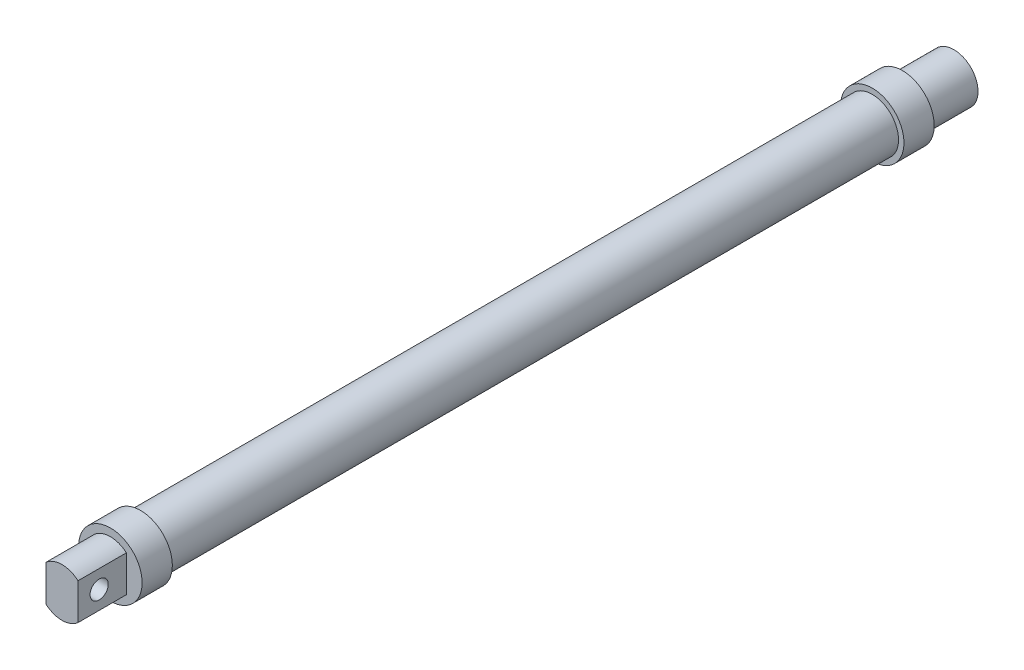
ISO-10303-21;
HEADER;
FILE_DESCRIPTION(('STEP AP214'),'2;1');
FILE_NAME('part.step','',(''),(''),'','','');
FILE_SCHEMA(('AUTOMOTIVE_DESIGN { 1 0 10303 214 1 1 1 1 }'));
ENDSEC;
DATA;
#1=APPLICATION_CONTEXT('core data for automotive mechanical design processes');
#2=APPLICATION_PROTOCOL_DEFINITION('international standard','automotive_design',2000,#1);
#3=PRODUCT_CONTEXT('',#1,'mechanical');
#4=PRODUCT('Part','Part','',(#3));
#5=PRODUCT_RELATED_PRODUCT_CATEGORY('part','',(#4));
#6=PRODUCT_DEFINITION_FORMATION('','',#4);
#7=PRODUCT_DEFINITION_CONTEXT('part definition',#1,'design');
#8=PRODUCT_DEFINITION('design','',#6,#7);
#9=PRODUCT_DEFINITION_SHAPE('','',#8);
#10=(LENGTH_UNIT() NAMED_UNIT(*) SI_UNIT(.MILLI.,.METRE.));
#11=(NAMED_UNIT(*) PLANE_ANGLE_UNIT() SI_UNIT($,.RADIAN.));
#12=(NAMED_UNIT(*) SI_UNIT($,.STERADIAN.) SOLID_ANGLE_UNIT());
#13=UNCERTAINTY_MEASURE_WITH_UNIT(LENGTH_MEASURE(1.E-05),#10,'distance_accuracy_value','');
#14=(GEOMETRIC_REPRESENTATION_CONTEXT(3) GLOBAL_UNCERTAINTY_ASSIGNED_CONTEXT((#13)) GLOBAL_UNIT_ASSIGNED_CONTEXT((#10,
#11,#12)) REPRESENTATION_CONTEXT('',''));
#15=CARTESIAN_POINT('',(0.,0.,0.));
#16=DIRECTION('',(0.,0.,1.));
#17=DIRECTION('',(1.,0.,0.));
#18=AXIS2_PLACEMENT_3D('',#15,#16,#17);
#19=CARTESIAN_POINT('',(0.,0.,-252.));
#20=DIRECTION('',(0.,0.,-1.));
#21=DIRECTION('',(-1.,0.,0.));
#22=AXIS2_PLACEMENT_3D('',#19,#20,#21);
#23=PLANE('',#22);
#24=CARTESIAN_POINT('',(0.,0.,-252.));
#25=DIRECTION('',(0.,0.,-1.));
#26=DIRECTION('',(-1.,0.,0.));
#27=AXIS2_PLACEMENT_3D('',#24,#25,#26);
#28=CIRCLE('',#27,10.5);
#29=CARTESIAN_POINT('',(-10.5,0.,-252.));
#30=VERTEX_POINT('',#29);
#31=EDGE_CURVE('E162',#30,#30,#28,.T.);
#32=ORIENTED_EDGE('',*,*,#31,.T.);
#33=EDGE_LOOP('',(#32));
#34=FACE_BOUND('',#33,.T.);
#35=CARTESIAN_POINT('',(0.,0.,-252.));
#36=DIRECTION('',(0.,0.,-1.));
#37=DIRECTION('',(-1.,0.,0.));
#38=AXIS2_PLACEMENT_3D('',#35,#36,#37);
#39=CIRCLE('',#38,8.);
#40=CARTESIAN_POINT('',(-8.,0.,-252.));
#41=VERTEX_POINT('',#40);
#42=EDGE_CURVE('E171',#41,#41,#39,.T.);
#43=ORIENTED_EDGE('',*,*,#42,.F.);
#44=EDGE_LOOP('',(#43));
#45=FACE_BOUND('',#44,.T.);
#46=ADVANCED_FACE('F36',(#34,#45),#23,.T.);
#47=CARTESIAN_POINT('',(0.,0.,0.));
#48=DIRECTION('',(0.,0.,1.));
#49=DIRECTION('',(1.,0.,0.));
#50=AXIS2_PLACEMENT_3D('',#47,#48,#49);
#51=PLANE('',#50);
#52=CARTESIAN_POINT('',(0.,0.,0.));
#53=DIRECTION('',(0.,0.,1.));
#54=DIRECTION('',(1.,0.,0.));
#55=AXIS2_PLACEMENT_3D('',#52,#53,#54);
#56=CIRCLE('',#55,10.5);
#57=CARTESIAN_POINT('',(10.5,0.,0.));
#58=VERTEX_POINT('',#57);
#59=EDGE_CURVE('E115',#58,#58,#56,.T.);
#60=ORIENTED_EDGE('',*,*,#59,.F.);
#61=EDGE_LOOP('',(#60));
#62=FACE_BOUND('',#61,.T.);
#63=CARTESIAN_POINT('',(0.,0.,0.));
#64=DIRECTION('',(0.,0.,1.));
#65=DIRECTION('',(1.,0.,0.));
#66=AXIS2_PLACEMENT_3D('',#63,#64,#65);
#67=CIRCLE('',#66,8.7);
#68=CARTESIAN_POINT('',(8.7,0.,0.));
#69=VERTEX_POINT('',#68);
#70=EDGE_CURVE('E11',#69,#69,#67,.F.);
#71=ORIENTED_EDGE('',*,*,#70,.F.);
#72=EDGE_LOOP('',(#71));
#73=FACE_BOUND('',#72,.T.);
#74=ADVANCED_FACE('F121',(#62,#73),#51,.F.);
#75=CARTESIAN_POINT('',(0.,0.,10.));
#76=DIRECTION('',(0.,0.,-1.));
#77=DIRECTION('',(-1.,0.,0.));
#78=AXIS2_PLACEMENT_3D('',#75,#76,#77);
#79=CYLINDRICAL_SURFACE('',#78,10.5);
#80=CARTESIAN_POINT('',(0.,0.,10.));
#81=DIRECTION('',(0.,0.,1.));
#82=DIRECTION('',(1.,0.,0.));
#83=AXIS2_PLACEMENT_3D('',#80,#81,#82);
#84=CIRCLE('',#83,10.5);
#85=CARTESIAN_POINT('',(10.5,0.,10.));
#86=VERTEX_POINT('',#85);
#87=EDGE_CURVE('E44',#86,#86,#84,.T.);
#88=ORIENTED_EDGE('',*,*,#87,.F.);
#89=EDGE_LOOP('',(#88));
#90=FACE_BOUND('',#89,.T.);
#91=ORIENTED_EDGE('',*,*,#59,.T.);
#92=EDGE_LOOP('',(#91));
#93=FACE_BOUND('',#92,.T.);
#94=ADVANCED_FACE('F38',(#90,#93),#79,.T.);
#95=CARTESIAN_POINT('',(0.,0.,10.));
#96=DIRECTION('',(0.,0.,1.));
#97=DIRECTION('',(1.,0.,0.));
#98=AXIS2_PLACEMENT_3D('',#95,#96,#97);
#99=PLANE('',#98);
#100=DIRECTION('',(0.,1.,0.));
#101=VECTOR('',#100,1.);
#102=CARTESIAN_POINT('',(-5.29150262212918,-23.2414213562373,10.));
#103=LINE('',#102,#101);
#104=CARTESIAN_POINT('',(-5.29150262212918,-6.,10.));
#105=VERTEX_POINT('',#104);
#106=CARTESIAN_POINT('',(-5.29150262212918,6.,10.));
#107=VERTEX_POINT('',#106);
#108=EDGE_CURVE('E103',#105,#107,#103,.T.);
#109=ORIENTED_EDGE('',*,*,#108,.T.);
#110=CARTESIAN_POINT('',(0.,0.,10.));
#111=DIRECTION('',(0.,0.,1.));
#112=DIRECTION('',(1.,0.,0.));
#113=AXIS2_PLACEMENT_3D('',#110,#111,#112);
#114=CIRCLE('',#113,8.);
#115=CARTESIAN_POINT('',(5.29150262212918,6.,10.));
#116=VERTEX_POINT('',#115);
#117=EDGE_CURVE('E110',#116,#107,#114,.T.);
#118=ORIENTED_EDGE('',*,*,#117,.F.);
#119=DIRECTION('',(0.,1.,0.));
#120=VECTOR('',#119,1.);
#121=CARTESIAN_POINT('',(5.29150262212918,-23.2414213562373,10.));
#122=LINE('',#121,#120);
#123=CARTESIAN_POINT('',(5.29150262212918,-6.,10.));
#124=VERTEX_POINT('',#123);
#125=EDGE_CURVE('E108',#124,#116,#122,.T.);
#126=ORIENTED_EDGE('',*,*,#125,.F.);
#127=CARTESIAN_POINT('',(0.,0.,10.));
#128=DIRECTION('',(0.,0.,1.));
#129=DIRECTION('',(1.,0.,0.));
#130=AXIS2_PLACEMENT_3D('',#127,#128,#129);
#131=CIRCLE('',#130,8.);
#132=EDGE_CURVE('E94',#105,#124,#131,.T.);
#133=ORIENTED_EDGE('',*,*,#132,.F.);
#134=EDGE_LOOP('',(#109,#118,#126,#133));
#135=FACE_BOUND('',#134,.T.);
#136=ORIENTED_EDGE('',*,*,#87,.T.);
#137=EDGE_LOOP('',(#136));
#138=FACE_BOUND('',#137,.T.);
#139=ADVANCED_FACE('F183',(#135,#138),#99,.T.);
#140=CARTESIAN_POINT('',(-5.29150262212918,-23.2414213562373,26.));
#141=DIRECTION('',(-1.,0.,0.));
#142=DIRECTION('',(0.,0.,1.));
#143=AXIS2_PLACEMENT_3D('',#140,#141,#142);
#144=PLANE('',#143);
#145=CARTESIAN_POINT('',(-5.29150262212918,0.,19.));
#146=DIRECTION('',(-1.,0.,0.));
#147=DIRECTION('',(0.,0.,1.));
#148=AXIS2_PLACEMENT_3D('',#145,#146,#147);
#149=CIRCLE('',#148,3.);
#150=CARTESIAN_POINT('',(-5.29150262212918,0.,22.));
#151=VERTEX_POINT('',#150);
#152=EDGE_CURVE('E177',#151,#151,#149,.F.);
#153=ORIENTED_EDGE('',*,*,#152,.T.);
#154=EDGE_LOOP('',(#153));
#155=FACE_BOUND('',#154,.T.);
#156=ORIENTED_EDGE('',*,*,#108,.F.);
#157=DIRECTION('',(0.,0.,-1.));
#158=VECTOR('',#157,1.);
#159=CARTESIAN_POINT('',(-5.29150262212918,-6.,26.));
#160=LINE('',#159,#158);
#161=CARTESIAN_POINT('',(-5.29150262212918,-6.,26.));
#162=VERTEX_POINT('',#161);
#163=EDGE_CURVE('E79',#162,#105,#160,.T.);
#164=ORIENTED_EDGE('',*,*,#163,.F.);
#165=DIRECTION('',(0.,1.,0.));
#166=VECTOR('',#165,1.);
#167=CARTESIAN_POINT('',(-5.29150262212918,-23.2414213562373,26.));
#168=LINE('',#167,#166);
#169=CARTESIAN_POINT('',(-5.29150262212918,6.,26.));
#170=VERTEX_POINT('',#169);
#171=EDGE_CURVE('E87',#162,#170,#168,.T.);
#172=ORIENTED_EDGE('',*,*,#171,.T.);
#173=DIRECTION('',(0.,0.,-1.));
#174=VECTOR('',#173,1.);
#175=CARTESIAN_POINT('',(-5.29150262212918,6.,26.));
#176=LINE('',#175,#174);
#177=EDGE_CURVE('E76',#170,#107,#176,.T.);
#178=ORIENTED_EDGE('',*,*,#177,.T.);
#179=EDGE_LOOP('',(#156,#164,#172,#178));
#180=FACE_BOUND('',#179,.T.);
#181=ADVANCED_FACE('F181',(#155,#180),#144,.T.);
#182=CARTESIAN_POINT('',(0.,0.,26.));
#183=DIRECTION('',(0.,0.,-1.));
#184=DIRECTION('',(-1.,0.,0.));
#185=AXIS2_PLACEMENT_3D('',#182,#183,#184);
#186=CYLINDRICAL_SURFACE('',#185,8.);
#187=ORIENTED_EDGE('',*,*,#132,.T.);
#188=DIRECTION('',(0.,0.,-1.));
#189=VECTOR('',#188,1.);
#190=CARTESIAN_POINT('',(5.29150262212918,-6.,26.));
#191=LINE('',#190,#189);
#192=CARTESIAN_POINT('',(5.29150262212918,-6.,26.));
#193=VERTEX_POINT('',#192);
#194=EDGE_CURVE('E91',#193,#124,#191,.T.);
#195=ORIENTED_EDGE('',*,*,#194,.F.);
#196=CARTESIAN_POINT('',(0.,0.,26.));
#197=DIRECTION('',(0.,0.,1.));
#198=DIRECTION('',(1.,0.,0.));
#199=AXIS2_PLACEMENT_3D('',#196,#197,#198);
#200=CIRCLE('',#199,8.);
#201=EDGE_CURVE('E82',#162,#193,#200,.T.);
#202=ORIENTED_EDGE('',*,*,#201,.F.);
#203=ORIENTED_EDGE('',*,*,#163,.T.);
#204=EDGE_LOOP('',(#187,#195,#202,#203));
#205=FACE_BOUND('',#204,.T.);
#206=ADVANCED_FACE('F92',(#205),#186,.T.);
#207=CARTESIAN_POINT('',(5.29150262212918,-23.2414213562373,26.));
#208=DIRECTION('',(-1.,0.,0.));
#209=DIRECTION('',(0.,0.,1.));
#210=AXIS2_PLACEMENT_3D('',#207,#208,#209);
#211=PLANE('',#210);
#212=CARTESIAN_POINT('',(5.29150262212918,0.,19.));
#213=DIRECTION('',(1.,0.,0.));
#214=DIRECTION('',(0.,0.,-1.));
#215=AXIS2_PLACEMENT_3D('',#212,#213,#214);
#216=CIRCLE('',#215,3.);
#217=CARTESIAN_POINT('',(5.29150262212918,0.,16.));
#218=VERTEX_POINT('',#217);
#219=EDGE_CURVE('E106',#218,#218,#216,.T.);
#220=ORIENTED_EDGE('',*,*,#219,.F.);
#221=EDGE_LOOP('',(#220));
#222=FACE_BOUND('',#221,.T.);
#223=ORIENTED_EDGE('',*,*,#125,.T.);
#224=DIRECTION('',(0.,0.,-1.));
#225=VECTOR('',#224,1.);
#226=CARTESIAN_POINT('',(5.29150262212918,6.,26.));
#227=LINE('',#226,#225);
#228=CARTESIAN_POINT('',(5.29150262212918,6.,26.));
#229=VERTEX_POINT('',#228);
#230=EDGE_CURVE('E51',#229,#116,#227,.T.);
#231=ORIENTED_EDGE('',*,*,#230,.F.);
#232=DIRECTION('',(0.,1.,0.));
#233=VECTOR('',#232,1.);
#234=CARTESIAN_POINT('',(5.29150262212918,-23.2414213562373,26.));
#235=LINE('',#234,#233);
#236=EDGE_CURVE('E86',#193,#229,#235,.T.);
#237=ORIENTED_EDGE('',*,*,#236,.F.);
#238=ORIENTED_EDGE('',*,*,#194,.T.);
#239=EDGE_LOOP('',(#223,#231,#237,#238));
#240=FACE_BOUND('',#239,.T.);
#241=ADVANCED_FACE('F98',(#222,#240),#211,.F.);
#242=CARTESIAN_POINT('',(0.,0.,26.));
#243=DIRECTION('',(0.,0.,-1.));
#244=DIRECTION('',(-1.,0.,0.));
#245=AXIS2_PLACEMENT_3D('',#242,#243,#244);
#246=CYLINDRICAL_SURFACE('',#245,8.);
#247=ORIENTED_EDGE('',*,*,#117,.T.);
#248=ORIENTED_EDGE('',*,*,#177,.F.);
#249=CARTESIAN_POINT('',(0.,0.,26.));
#250=DIRECTION('',(0.,0.,1.));
#251=DIRECTION('',(1.,0.,0.));
#252=AXIS2_PLACEMENT_3D('',#249,#250,#251);
#253=CIRCLE('',#252,8.);
#254=EDGE_CURVE('E59',#229,#170,#253,.T.);
#255=ORIENTED_EDGE('',*,*,#254,.F.);
#256=ORIENTED_EDGE('',*,*,#230,.T.);
#257=EDGE_LOOP('',(#247,#248,#255,#256));
#258=FACE_BOUND('',#257,.T.);
#259=ADVANCED_FACE('F196',(#258),#246,.T.);
#260=CARTESIAN_POINT('',(0.,-23.2414213562373,26.));
#261=DIRECTION('',(0.,0.,1.));
#262=DIRECTION('',(1.,0.,0.));
#263=AXIS2_PLACEMENT_3D('',#260,#261,#262);
#264=PLANE('',#263);
#265=ORIENTED_EDGE('',*,*,#171,.F.);
#266=ORIENTED_EDGE('',*,*,#201,.T.);
#267=ORIENTED_EDGE('',*,*,#236,.T.);
#268=ORIENTED_EDGE('',*,*,#254,.T.);
#269=EDGE_LOOP('',(#265,#266,#267,#268));
#270=FACE_BOUND('',#269,.T.);
#271=ADVANCED_FACE('F84',(#270),#264,.T.);
#272=CARTESIAN_POINT('',(-10.501,0.,19.));
#273=DIRECTION('',(1.,0.,0.));
#274=DIRECTION('',(0.,0.,-1.));
#275=AXIS2_PLACEMENT_3D('',#272,#273,#274);
#276=CYLINDRICAL_SURFACE('',#275,3.);
#277=ORIENTED_EDGE('',*,*,#152,.F.);
#278=EDGE_LOOP('',(#277));
#279=FACE_BOUND('',#278,.T.);
#280=ORIENTED_EDGE('',*,*,#219,.T.);
#281=EDGE_LOOP('',(#280));
#282=FACE_BOUND('',#281,.T.);
#283=ADVANCED_FACE('F129',(#279,#282),#276,.F.);
#284=CARTESIAN_POINT('',(0.,0.,-242.));
#285=DIRECTION('',(0.,0.,1.));
#286=DIRECTION('',(1.,0.,0.));
#287=AXIS2_PLACEMENT_3D('',#284,#285,#286);
#288=CYLINDRICAL_SURFACE('',#287,8.7);
#289=CARTESIAN_POINT('',(0.,0.,-242.));
#290=DIRECTION('',(0.,0.,-1.));
#291=DIRECTION('',(-1.,0.,0.));
#292=AXIS2_PLACEMENT_3D('',#289,#290,#291);
#293=CIRCLE('',#292,8.7);
#294=CARTESIAN_POINT('',(-8.7,0.,-242.));
#295=VERTEX_POINT('',#294);
#296=EDGE_CURVE('E168',#295,#295,#293,.T.);
#297=ORIENTED_EDGE('',*,*,#296,.F.);
#298=EDGE_LOOP('',(#297));
#299=FACE_BOUND('',#298,.T.);
#300=ORIENTED_EDGE('',*,*,#70,.T.);
#301=EDGE_LOOP('',(#300));
#302=FACE_BOUND('',#301,.T.);
#303=ADVANCED_FACE('F126',(#299,#302),#288,.T.);
#304=CARTESIAN_POINT('',(0.,0.,-242.));
#305=DIRECTION('',(0.,0.,-1.));
#306=DIRECTION('',(-1.,0.,0.));
#307=AXIS2_PLACEMENT_3D('',#304,#305,#306);
#308=PLANE('',#307);
#309=CARTESIAN_POINT('',(0.,0.,-242.));
#310=DIRECTION('',(0.,0.,-1.));
#311=DIRECTION('',(-1.,0.,0.));
#312=AXIS2_PLACEMENT_3D('',#309,#310,#311);
#313=CIRCLE('',#312,10.5);
#314=CARTESIAN_POINT('',(-10.5,0.,-242.));
#315=VERTEX_POINT('',#314);
#316=EDGE_CURVE('E165',#315,#315,#313,.T.);
#317=ORIENTED_EDGE('',*,*,#316,.F.);
#318=EDGE_LOOP('',(#317));
#319=FACE_BOUND('',#318,.T.);
#320=ORIENTED_EDGE('',*,*,#296,.T.);
#321=EDGE_LOOP('',(#320));
#322=FACE_BOUND('',#321,.T.);
#323=ADVANCED_FACE('F128',(#319,#322),#308,.F.);
#324=CARTESIAN_POINT('',(0.,0.,-252.));
#325=DIRECTION('',(0.,0.,1.));
#326=DIRECTION('',(1.,0.,0.));
#327=AXIS2_PLACEMENT_3D('',#324,#325,#326);
#328=CYLINDRICAL_SURFACE('',#327,10.5);
#329=ORIENTED_EDGE('',*,*,#31,.F.);
#330=EDGE_LOOP('',(#329));
#331=FACE_BOUND('',#330,.T.);
#332=ORIENTED_EDGE('',*,*,#316,.T.);
#333=EDGE_LOOP('',(#332));
#334=FACE_BOUND('',#333,.T.);
#335=ADVANCED_FACE('F136',(#331,#334),#328,.T.);
#336=CARTESIAN_POINT('',(0.,0.,-269.));
#337=DIRECTION('',(0.,0.,1.));
#338=DIRECTION('',(1.,0.,0.));
#339=AXIS2_PLACEMENT_3D('',#336,#337,#338);
#340=CYLINDRICAL_SURFACE('',#339,8.);
#341=CARTESIAN_POINT('',(0.,0.,-269.));
#342=DIRECTION('',(0.,0.,-1.));
#343=DIRECTION('',(-1.,0.,0.));
#344=AXIS2_PLACEMENT_3D('',#341,#342,#343);
#345=CIRCLE('',#344,8.);
#346=CARTESIAN_POINT('',(-8.,0.,-269.));
#347=VERTEX_POINT('',#346);
#348=EDGE_CURVE('E166',#347,#347,#345,.T.);
#349=ORIENTED_EDGE('',*,*,#348,.F.);
#350=EDGE_LOOP('',(#349));
#351=FACE_BOUND('',#350,.T.);
#352=ORIENTED_EDGE('',*,*,#42,.T.);
#353=EDGE_LOOP('',(#352));
#354=FACE_BOUND('',#353,.T.);
#355=ADVANCED_FACE('F151',(#351,#354),#340,.T.);
#356=CARTESIAN_POINT('',(0.,0.,-269.));
#357=DIRECTION('',(0.,0.,-1.));
#358=DIRECTION('',(-1.,0.,0.));
#359=AXIS2_PLACEMENT_3D('',#356,#357,#358);
#360=PLANE('',#359);
#361=CARTESIAN_POINT('',(0.,0.,-269.));
#362=DIRECTION('',(0.,0.,-1.));
#363=DIRECTION('',(-1.,0.,0.));
#364=AXIS2_PLACEMENT_3D('',#361,#362,#363);
#365=CIRCLE('',#364,3.);
#366=CARTESIAN_POINT('',(-3.,0.,-269.));
#367=VERTEX_POINT('',#366);
#368=EDGE_CURVE('E278',#367,#367,#365,.T.);
#369=ORIENTED_EDGE('',*,*,#368,.F.);
#370=EDGE_LOOP('',(#369));
#371=FACE_BOUND('',#370,.T.);
#372=ORIENTED_EDGE('',*,*,#348,.T.);
#373=EDGE_LOOP('',(#372));
#374=FACE_BOUND('',#373,.T.);
#375=ADVANCED_FACE('F158',(#371,#374),#360,.T.);
#376=CARTESIAN_POINT('',(0.,0.,-68.));
#377=DIRECTION('',(0.,0.,-1.));
#378=DIRECTION('',(-1.,0.,0.));
#379=AXIS2_PLACEMENT_3D('',#376,#377,#378);
#380=CYLINDRICAL_SURFACE('',#379,3.);
#381=CARTESIAN_POINT('',(0.,0.,-68.));
#382=DIRECTION('',(0.,0.,-1.));
#383=DIRECTION('',(-1.,0.,0.));
#384=AXIS2_PLACEMENT_3D('',#381,#382,#383);
#385=CIRCLE('',#384,3.);
#386=CARTESIAN_POINT('',(-3.,0.,-68.));
#387=VERTEX_POINT('',#386);
#388=EDGE_CURVE('E277',#387,#387,#385,.T.);
#389=ORIENTED_EDGE('',*,*,#388,.F.);
#390=EDGE_LOOP('',(#389));
#391=FACE_BOUND('',#390,.T.);
#392=ORIENTED_EDGE('',*,*,#368,.T.);
#393=EDGE_LOOP('',(#392));
#394=FACE_BOUND('',#393,.T.);
#395=ADVANCED_FACE('F252',(#391,#394),#380,.F.);
#396=CARTESIAN_POINT('',(0.,0.,-68.));
#397=DIRECTION('',(0.,0.,-1.));
#398=DIRECTION('',(-1.,0.,0.));
#399=AXIS2_PLACEMENT_3D('',#396,#397,#398);
#400=PLANE('',#399);
#401=ORIENTED_EDGE('',*,*,#388,.T.);
#402=EDGE_LOOP('',(#401));
#403=FACE_BOUND('',#402,.T.);
#404=ADVANCED_FACE('F261',(#403),#400,.T.);
#405=CLOSED_SHELL('',(#46,#74,#94,#139,#181,#206,#241,#259,#271,#283,#303,#323,#335,#355,#375,
#395,#404));
#406=MANIFOLD_SOLID_BREP('B2',#405);
#407=ADVANCED_BREP_SHAPE_REPRESENTATION('',(#18,#406),#14);
#408=SHAPE_DEFINITION_REPRESENTATION(#9,#407);
ENDSEC;
END-ISO-10303-21;
